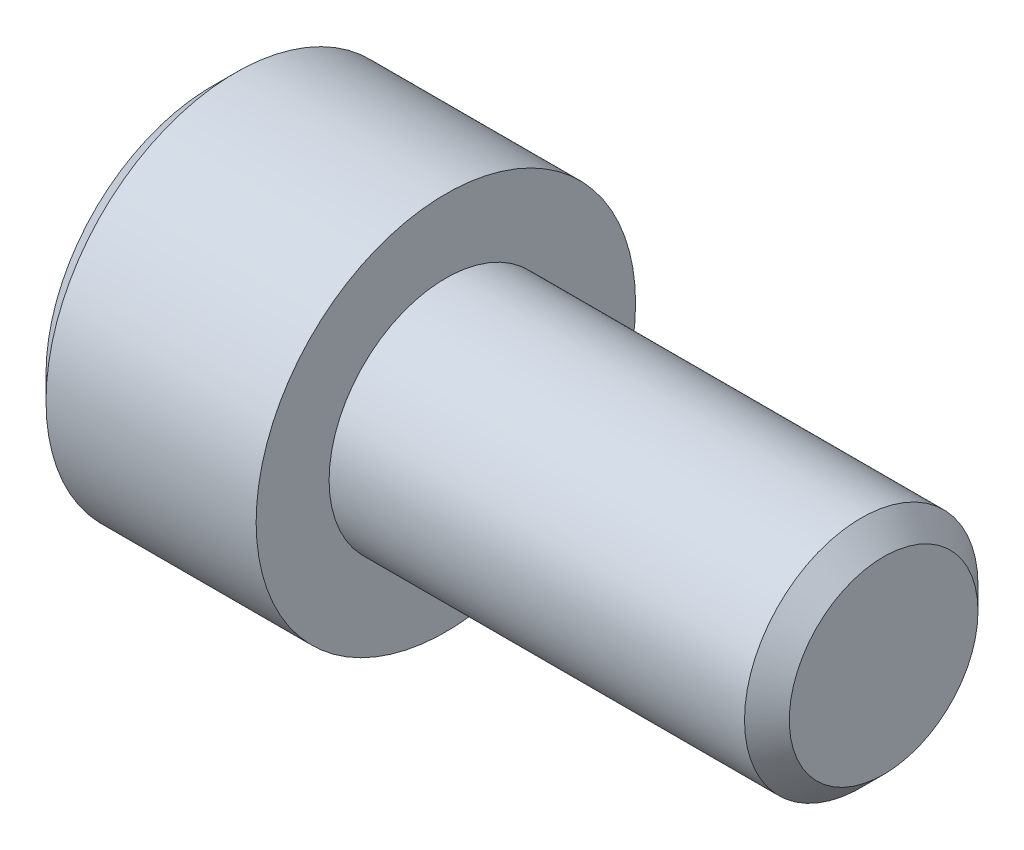
ISO-10303-21;
HEADER;
FILE_DESCRIPTION(('STEP AP214'),'2;1');
FILE_NAME('part.step','',(''),(''),'','','');
FILE_SCHEMA(('AUTOMOTIVE_DESIGN { 1 0 10303 214 1 1 1 1 }'));
ENDSEC;
DATA;
#1=APPLICATION_CONTEXT('core data for automotive mechanical design processes');
#2=APPLICATION_PROTOCOL_DEFINITION('international standard','automotive_design',2000,#1);
#3=PRODUCT_CONTEXT('',#1,'mechanical');
#4=PRODUCT('Part','Part','',(#3));
#5=PRODUCT_RELATED_PRODUCT_CATEGORY('part','',(#4));
#6=PRODUCT_DEFINITION_FORMATION('','',#4);
#7=PRODUCT_DEFINITION_CONTEXT('part definition',#1,'design');
#8=PRODUCT_DEFINITION('design','',#6,#7);
#9=PRODUCT_DEFINITION_SHAPE('','',#8);
#10=(LENGTH_UNIT() NAMED_UNIT(*) SI_UNIT(.MILLI.,.METRE.));
#11=(NAMED_UNIT(*) PLANE_ANGLE_UNIT() SI_UNIT($,.RADIAN.));
#12=(NAMED_UNIT(*) SI_UNIT($,.STERADIAN.) SOLID_ANGLE_UNIT());
#13=UNCERTAINTY_MEASURE_WITH_UNIT(LENGTH_MEASURE(1.E-05),#10,'distance_accuracy_value','');
#14=(GEOMETRIC_REPRESENTATION_CONTEXT(3) GLOBAL_UNCERTAINTY_ASSIGNED_CONTEXT((#13)) GLOBAL_UNIT_ASSIGNED_CONTEXT((#10,
#11,#12)) REPRESENTATION_CONTEXT('',''));
#15=CARTESIAN_POINT('',(0.,0.,0.));
#16=DIRECTION('',(0.,0.,1.));
#17=DIRECTION('',(1.,0.,0.));
#18=AXIS2_PLACEMENT_3D('',#15,#16,#17);
#19=CARTESIAN_POINT('',(-8.,0.,0.));
#20=DIRECTION('',(1.,0.,0.));
#21=DIRECTION('',(0.,0.,-1.));
#22=AXIS2_PLACEMENT_3D('',#19,#20,#21);
#23=PLANE('',#22);
#24=CARTESIAN_POINT('',(-8.,0.,0.));
#25=DIRECTION('',(1.,0.,0.));
#26=DIRECTION('',(0.,0.,-1.));
#27=AXIS2_PLACEMENT_3D('',#24,#25,#26);
#28=CIRCLE('',#27,5.7);
#29=CARTESIAN_POINT('',(-8.,0.,-5.7));
#30=VERTEX_POINT('',#29);
#31=EDGE_CURVE('E115',#30,#30,#28,.T.);
#32=ORIENTED_EDGE('',*,*,#31,.F.);
#33=EDGE_LOOP('',(#32));
#34=FACE_BOUND('',#33,.T.);
#35=DIRECTION('',(0.,0.500000000000001,-0.866025403784438));
#36=VECTOR('',#35,1.);
#37=CARTESIAN_POINT('',(-8.,-3.4641016151378,0.));
#38=LINE('',#37,#36);
#39=CARTESIAN_POINT('',(-8.,-3.4641016151378,0.));
#40=VERTEX_POINT('',#39);
#41=CARTESIAN_POINT('',(-8.,-1.7320508075689,-3.));
#42=VERTEX_POINT('',#41);
#43=EDGE_CURVE('E100',#40,#42,#38,.T.);
#44=ORIENTED_EDGE('',*,*,#43,.T.);
#45=DIRECTION('',(0.,1.,0.));
#46=VECTOR('',#45,1.);
#47=CARTESIAN_POINT('',(-8.,-1.7320508075689,-3.));
#48=LINE('',#47,#46);
#49=CARTESIAN_POINT('',(-8.,1.7320508075689,-3.));
#50=VERTEX_POINT('',#49);
#51=EDGE_CURVE('E88',#42,#50,#48,.T.);
#52=ORIENTED_EDGE('',*,*,#51,.T.);
#53=DIRECTION('',(0.,0.500000000000001,0.866025403784438));
#54=VECTOR('',#53,1.);
#55=CARTESIAN_POINT('',(-8.,1.7320508075689,-3.));
#56=LINE('',#55,#54);
#57=CARTESIAN_POINT('',(-8.,3.4641016151378,0.));
#58=VERTEX_POINT('',#57);
#59=EDGE_CURVE('E99',#50,#58,#56,.T.);
#60=ORIENTED_EDGE('',*,*,#59,.T.);
#61=DIRECTION('',(0.,-0.500000000000001,0.866025403784438));
#62=VECTOR('',#61,1.);
#63=CARTESIAN_POINT('',(-8.,3.4641016151378,0.));
#64=LINE('',#63,#62);
#65=CARTESIAN_POINT('',(-8.,1.7320508075689,3.));
#66=VERTEX_POINT('',#65);
#67=EDGE_CURVE('E125',#58,#66,#64,.T.);
#68=ORIENTED_EDGE('',*,*,#67,.T.);
#69=DIRECTION('',(0.,-1.,0.));
#70=VECTOR('',#69,1.);
#71=CARTESIAN_POINT('',(-8.,1.7320508075689,3.));
#72=LINE('',#71,#70);
#73=CARTESIAN_POINT('',(-8.,-1.7320508075689,3.));
#74=VERTEX_POINT('',#73);
#75=EDGE_CURVE('E130',#66,#74,#72,.T.);
#76=ORIENTED_EDGE('',*,*,#75,.T.);
#77=DIRECTION('',(0.,-0.500000000000001,-0.866025403784438));
#78=VECTOR('',#77,1.);
#79=CARTESIAN_POINT('',(-8.,-1.7320508075689,3.));
#80=LINE('',#79,#78);
#81=EDGE_CURVE('E114',#74,#40,#80,.T.);
#82=ORIENTED_EDGE('',*,*,#81,.T.);
#83=EDGE_LOOP('',(#44,#52,#60,#68,#76,#82));
#84=FACE_BOUND('',#83,.T.);
#85=ADVANCED_FACE('F16',(#34,#84),#23,.F.);
#86=CARTESIAN_POINT('',(-8.,0.,0.));
#87=DIRECTION('',(1.,0.,0.));
#88=DIRECTION('',(0.,0.,-1.));
#89=AXIS2_PLACEMENT_3D('',#86,#87,#88);
#90=CONICAL_SURFACE('',#89,5.7,0.785398163397449);
#91=CARTESIAN_POINT('',(-7.2,0.,0.));
#92=DIRECTION('',(1.,0.,0.));
#93=DIRECTION('',(0.,0.,-1.));
#94=AXIS2_PLACEMENT_3D('',#91,#92,#93);
#95=CIRCLE('',#94,6.5);
#96=CARTESIAN_POINT('',(-7.2,0.,-6.5));
#97=VERTEX_POINT('',#96);
#98=EDGE_CURVE('E137',#97,#97,#95,.T.);
#99=ORIENTED_EDGE('',*,*,#98,.F.);
#100=EDGE_LOOP('',(#99));
#101=FACE_BOUND('',#100,.T.);
#102=ORIENTED_EDGE('',*,*,#31,.T.);
#103=EDGE_LOOP('',(#102));
#104=FACE_BOUND('',#103,.T.);
#105=ADVANCED_FACE('F279',(#101,#104),#90,.T.);
#106=CARTESIAN_POINT('',(-4.,-3.4641016151378,0.));
#107=DIRECTION('',(0.,0.866025403784438,0.500000000000001));
#108=DIRECTION('',(0.,-0.500000000000001,0.866025403784438));
#109=AXIS2_PLACEMENT_3D('',#106,#107,#108);
#110=PLANE('',#109);
#111=ORIENTED_EDGE('',*,*,#43,.F.);
#112=DIRECTION('',(-1.,0.,0.));
#113=VECTOR('',#112,1.);
#114=CARTESIAN_POINT('',(-4.,-3.4641016151378,0.));
#115=LINE('',#114,#113);
#116=CARTESIAN_POINT('',(-4.,-3.4641016151378,0.));
#117=VERTEX_POINT('',#116);
#118=EDGE_CURVE('E142',#117,#40,#115,.T.);
#119=ORIENTED_EDGE('',*,*,#118,.F.);
#120=DIRECTION('',(0.,0.500000000000001,-0.866025403784438));
#121=VECTOR('',#120,1.);
#122=CARTESIAN_POINT('',(-4.,-3.4641016151378,0.));
#123=LINE('',#122,#121);
#124=CARTESIAN_POINT('',(-4.,-2.5980762113533,-1.5));
#125=VERTEX_POINT('',#124);
#126=EDGE_CURVE('E144',#117,#125,#123,.T.);
#127=ORIENTED_EDGE('',*,*,#126,.T.);
#128=DIRECTION('',(0.,0.500000000000001,-0.866025403784438));
#129=VECTOR('',#128,1.);
#130=CARTESIAN_POINT('',(-4.,-2.59807621135334,-1.50000000000002));
#131=LINE('',#130,#129);
#132=CARTESIAN_POINT('',(-4.,-1.7320508075689,-3.));
#133=VERTEX_POINT('',#132);
#134=EDGE_CURVE('E109',#125,#133,#131,.T.);
#135=ORIENTED_EDGE('',*,*,#134,.T.);
#136=DIRECTION('',(-1.,0.,0.));
#137=VECTOR('',#136,1.);
#138=CARTESIAN_POINT('',(-4.,-1.7320508075689,-3.));
#139=LINE('',#138,#137);
#140=EDGE_CURVE('E92',#133,#42,#139,.T.);
#141=ORIENTED_EDGE('',*,*,#140,.T.);
#142=EDGE_LOOP('',(#111,#119,#127,#135,#141));
#143=FACE_BOUND('',#142,.T.);
#144=ADVANCED_FACE('F105',(#143),#110,.T.);
#145=CARTESIAN_POINT('',(-4.,-1.7320508075689,-3.));
#146=DIRECTION('',(0.,0.,1.));
#147=DIRECTION('',(1.,0.,0.));
#148=AXIS2_PLACEMENT_3D('',#145,#146,#147);
#149=PLANE('',#148);
#150=ORIENTED_EDGE('',*,*,#51,.F.);
#151=ORIENTED_EDGE('',*,*,#140,.F.);
#152=DIRECTION('',(0.,1.,0.));
#153=VECTOR('',#152,1.);
#154=CARTESIAN_POINT('',(-4.,-1.7320508075689,-3.));
#155=LINE('',#154,#153);
#156=CARTESIAN_POINT('',(-4.,0.,-3.));
#157=VERTEX_POINT('',#156);
#158=EDGE_CURVE('E110',#133,#157,#155,.T.);
#159=ORIENTED_EDGE('',*,*,#158,.T.);
#160=DIRECTION('',(0.,1.,0.));
#161=VECTOR('',#160,1.);
#162=CARTESIAN_POINT('',(-4.,0.,-3.));
#163=LINE('',#162,#161);
#164=CARTESIAN_POINT('',(-4.,1.7320508075689,-3.));
#165=VERTEX_POINT('',#164);
#166=EDGE_CURVE('E156',#157,#165,#163,.T.);
#167=ORIENTED_EDGE('',*,*,#166,.T.);
#168=DIRECTION('',(-1.,0.,0.));
#169=VECTOR('',#168,1.);
#170=CARTESIAN_POINT('',(-4.,1.7320508075689,-3.));
#171=LINE('',#170,#169);
#172=EDGE_CURVE('E95',#165,#50,#171,.T.);
#173=ORIENTED_EDGE('',*,*,#172,.T.);
#174=EDGE_LOOP('',(#150,#151,#159,#167,#173));
#175=FACE_BOUND('',#174,.T.);
#176=ADVANCED_FACE('F90',(#175),#149,.T.);
#177=CARTESIAN_POINT('',(-4.,1.7320508075689,-3.));
#178=DIRECTION('',(0.,-0.866025403784438,0.500000000000001));
#179=DIRECTION('',(0.,-0.500000000000001,-0.866025403784438));
#180=AXIS2_PLACEMENT_3D('',#177,#178,#179);
#181=PLANE('',#180);
#182=ORIENTED_EDGE('',*,*,#59,.F.);
#183=ORIENTED_EDGE('',*,*,#172,.F.);
#184=DIRECTION('',(0.,0.500000000000001,0.866025403784438));
#185=VECTOR('',#184,1.);
#186=CARTESIAN_POINT('',(-4.,1.7320508075689,-3.));
#187=LINE('',#186,#185);
#188=CARTESIAN_POINT('',(-4.,2.59807621135334,-1.50000000000003));
#189=VERTEX_POINT('',#188);
#190=EDGE_CURVE('E163',#165,#189,#187,.T.);
#191=ORIENTED_EDGE('',*,*,#190,.T.);
#192=DIRECTION('',(0.,0.500000000000001,0.866025403784438));
#193=VECTOR('',#192,1.);
#194=CARTESIAN_POINT('',(-4.,2.59807621135333,-1.50000000000002));
#195=LINE('',#194,#193);
#196=CARTESIAN_POINT('',(-4.,3.4641016151378,0.));
#197=VERTEX_POINT('',#196);
#198=EDGE_CURVE('E168',#189,#197,#195,.T.);
#199=ORIENTED_EDGE('',*,*,#198,.T.);
#200=DIRECTION('',(-1.,0.,0.));
#201=VECTOR('',#200,1.);
#202=CARTESIAN_POINT('',(-4.,3.4641016151378,0.));
#203=LINE('',#202,#201);
#204=EDGE_CURVE('E173',#197,#58,#203,.T.);
#205=ORIENTED_EDGE('',*,*,#204,.T.);
#206=EDGE_LOOP('',(#182,#183,#191,#199,#205));
#207=FACE_BOUND('',#206,.T.);
#208=ADVANCED_FACE('F295',(#207),#181,.T.);
#209=CARTESIAN_POINT('',(-4.,3.4641016151378,0.));
#210=DIRECTION('',(0.,-0.866025403784438,-0.500000000000001));
#211=DIRECTION('',(0.,0.500000000000001,-0.866025403784438));
#212=AXIS2_PLACEMENT_3D('',#209,#210,#211);
#213=PLANE('',#212);
#214=ORIENTED_EDGE('',*,*,#67,.F.);
#215=ORIENTED_EDGE('',*,*,#204,.F.);
#216=DIRECTION('',(0.,-0.500000000000001,0.866025403784438));
#217=VECTOR('',#216,1.);
#218=CARTESIAN_POINT('',(-4.,3.4641016151378,0.));
#219=LINE('',#218,#217);
#220=CARTESIAN_POINT('',(-4.,2.59807621135334,1.50000000000003));
#221=VERTEX_POINT('',#220);
#222=EDGE_CURVE('E178',#197,#221,#219,.T.);
#223=ORIENTED_EDGE('',*,*,#222,.T.);
#224=DIRECTION('',(0.,-0.500000000000001,0.866025403784438));
#225=VECTOR('',#224,1.);
#226=CARTESIAN_POINT('',(-4.,2.59807621135334,1.50000000000003));
#227=LINE('',#226,#225);
#228=CARTESIAN_POINT('',(-4.,1.7320508075689,3.));
#229=VERTEX_POINT('',#228);
#230=EDGE_CURVE('E183',#221,#229,#227,.T.);
#231=ORIENTED_EDGE('',*,*,#230,.T.);
#232=DIRECTION('',(-1.,0.,0.));
#233=VECTOR('',#232,1.);
#234=CARTESIAN_POINT('',(-4.,1.7320508075689,3.));
#235=LINE('',#234,#233);
#236=EDGE_CURVE('E188',#229,#66,#235,.T.);
#237=ORIENTED_EDGE('',*,*,#236,.T.);
#238=EDGE_LOOP('',(#214,#215,#223,#231,#237));
#239=FACE_BOUND('',#238,.T.);
#240=ADVANCED_FACE('F298',(#239),#213,.T.);
#241=CARTESIAN_POINT('',(-4.,1.7320508075689,3.));
#242=DIRECTION('',(0.,0.,-1.));
#243=DIRECTION('',(-1.,0.,0.));
#244=AXIS2_PLACEMENT_3D('',#241,#242,#243);
#245=PLANE('',#244);
#246=ORIENTED_EDGE('',*,*,#75,.F.);
#247=ORIENTED_EDGE('',*,*,#236,.F.);
#248=DIRECTION('',(0.,-1.,0.));
#249=VECTOR('',#248,1.);
#250=CARTESIAN_POINT('',(-4.,1.7320508075689,3.));
#251=LINE('',#250,#249);
#252=CARTESIAN_POINT('',(-4.,0.,3.));
#253=VERTEX_POINT('',#252);
#254=EDGE_CURVE('E193',#229,#253,#251,.T.);
#255=ORIENTED_EDGE('',*,*,#254,.T.);
#256=DIRECTION('',(0.,-1.,0.));
#257=VECTOR('',#256,1.);
#258=CARTESIAN_POINT('',(-4.,0.,3.));
#259=LINE('',#258,#257);
#260=CARTESIAN_POINT('',(-4.,-1.7320508075689,3.));
#261=VERTEX_POINT('',#260);
#262=EDGE_CURVE('E198',#253,#261,#259,.T.);
#263=ORIENTED_EDGE('',*,*,#262,.T.);
#264=DIRECTION('',(-1.,0.,0.));
#265=VECTOR('',#264,1.);
#266=CARTESIAN_POINT('',(-4.,-1.7320508075689,3.));
#267=LINE('',#266,#265);
#268=EDGE_CURVE('E203',#261,#74,#267,.T.);
#269=ORIENTED_EDGE('',*,*,#268,.T.);
#270=EDGE_LOOP('',(#246,#247,#255,#263,#269));
#271=FACE_BOUND('',#270,.T.);
#272=ADVANCED_FACE('F302',(#271),#245,.T.);
#273=CARTESIAN_POINT('',(-4.,-1.7320508075689,3.));
#274=DIRECTION('',(0.,0.866025403784438,-0.500000000000001));
#275=DIRECTION('',(0.,0.500000000000001,0.866025403784438));
#276=AXIS2_PLACEMENT_3D('',#273,#274,#275);
#277=PLANE('',#276);
#278=ORIENTED_EDGE('',*,*,#81,.F.);
#279=ORIENTED_EDGE('',*,*,#268,.F.);
#280=DIRECTION('',(0.,-0.500000000000001,-0.866025403784438));
#281=VECTOR('',#280,1.);
#282=CARTESIAN_POINT('',(-4.,-1.7320508075689,3.));
#283=LINE('',#282,#281);
#284=CARTESIAN_POINT('',(-4.,-2.59807621135334,1.50000000000003));
#285=VERTEX_POINT('',#284);
#286=EDGE_CURVE('E208',#261,#285,#283,.T.);
#287=ORIENTED_EDGE('',*,*,#286,.T.);
#288=DIRECTION('',(0.,-0.500000000000001,-0.866025403784438));
#289=VECTOR('',#288,1.);
#290=CARTESIAN_POINT('',(-4.,-2.59807621135333,1.50000000000002));
#291=LINE('',#290,#289);
#292=EDGE_CURVE('E213',#285,#117,#291,.T.);
#293=ORIENTED_EDGE('',*,*,#292,.T.);
#294=ORIENTED_EDGE('',*,*,#118,.T.);
#295=EDGE_LOOP('',(#278,#279,#287,#293,#294));
#296=FACE_BOUND('',#295,.T.);
#297=ADVANCED_FACE('F275',(#296),#277,.T.);
#298=CARTESIAN_POINT('',(15.,0.,0.));
#299=DIRECTION('',(1.,0.,0.));
#300=DIRECTION('',(0.,0.,-1.));
#301=AXIS2_PLACEMENT_3D('',#298,#299,#300);
#302=CYLINDRICAL_SURFACE('',#301,6.5);
#303=CARTESIAN_POINT('',(0.,0.,0.));
#304=DIRECTION('',(1.,0.,0.));
#305=DIRECTION('',(0.,0.,-1.));
#306=AXIS2_PLACEMENT_3D('',#303,#304,#305);
#307=CIRCLE('',#306,6.5);
#308=CARTESIAN_POINT('',(0.,0.,-6.5));
#309=VERTEX_POINT('',#308);
#310=EDGE_CURVE('E218',#309,#309,#307,.T.);
#311=ORIENTED_EDGE('',*,*,#310,.F.);
#312=EDGE_LOOP('',(#311));
#313=FACE_BOUND('',#312,.T.);
#314=ORIENTED_EDGE('',*,*,#98,.T.);
#315=EDGE_LOOP('',(#314));
#316=FACE_BOUND('',#315,.T.);
#317=ADVANCED_FACE('F271',(#313,#316),#302,.T.);
#318=CARTESIAN_POINT('',(-4.,0.,0.));
#319=DIRECTION('',(1.,0.,0.));
#320=DIRECTION('',(0.,0.,-1.));
#321=AXIS2_PLACEMENT_3D('',#318,#319,#320);
#322=PLANE('',#321);
#323=CARTESIAN_POINT('',(-4.,0.,0.));
#324=DIRECTION('',(1.,0.,0.));
#325=DIRECTION('',(0.,-0.866025403784436,0.500000000000005));
#326=AXIS2_PLACEMENT_3D('',#323,#324,#325);
#327=CIRCLE('',#326,3.);
#328=EDGE_CURVE('E34',#285,#125,#327,.T.);
#329=ORIENTED_EDGE('',*,*,#328,.T.);
#330=ORIENTED_EDGE('',*,*,#126,.F.);
#331=ORIENTED_EDGE('',*,*,#292,.F.);
#332=EDGE_LOOP('',(#329,#330,#331));
#333=FACE_BOUND('',#332,.T.);
#334=ADVANCED_FACE('F274',(#333),#322,.F.);
#335=CARTESIAN_POINT('',(-4.,0.,0.));
#336=DIRECTION('',(1.,0.,0.));
#337=DIRECTION('',(0.,-0.866025403784438,-0.500000000000002));
#338=AXIS2_PLACEMENT_3D('',#335,#336,#337);
#339=CIRCLE('',#338,3.);
#340=EDGE_CURVE('E224',#125,#157,#339,.T.);
#341=ORIENTED_EDGE('',*,*,#340,.T.);
#342=ORIENTED_EDGE('',*,*,#158,.F.);
#343=ORIENTED_EDGE('',*,*,#134,.F.);
#344=EDGE_LOOP('',(#341,#342,#343));
#345=FACE_BOUND('',#344,.T.);
#346=ADVANCED_FACE('F311',(#345),#322,.F.);
#347=CARTESIAN_POINT('',(-4.,0.,0.));
#348=DIRECTION('',(1.,0.,0.));
#349=DIRECTION('',(0.,0.,-1.));
#350=AXIS2_PLACEMENT_3D('',#347,#348,#349);
#351=CIRCLE('',#350,3.);
#352=EDGE_CURVE('E229',#157,#189,#351,.T.);
#353=ORIENTED_EDGE('',*,*,#352,.T.);
#354=ORIENTED_EDGE('',*,*,#190,.F.);
#355=ORIENTED_EDGE('',*,*,#166,.F.);
#356=EDGE_LOOP('',(#353,#354,#355));
#357=FACE_BOUND('',#356,.T.);
#358=ADVANCED_FACE('F379',(#357),#322,.F.);
#359=CARTESIAN_POINT('',(-4.,0.,0.));
#360=DIRECTION('',(1.,0.,0.));
#361=DIRECTION('',(0.,0.866025403784436,-0.500000000000005));
#362=AXIS2_PLACEMENT_3D('',#359,#360,#361);
#363=CIRCLE('',#362,3.);
#364=EDGE_CURVE('E234',#189,#221,#363,.T.);
#365=ORIENTED_EDGE('',*,*,#364,.T.);
#366=ORIENTED_EDGE('',*,*,#222,.F.);
#367=ORIENTED_EDGE('',*,*,#198,.F.);
#368=EDGE_LOOP('',(#365,#366,#367));
#369=FACE_BOUND('',#368,.T.);
#370=ADVANCED_FACE('F370',(#369),#322,.F.);
#371=CARTESIAN_POINT('',(-4.,0.,0.));
#372=DIRECTION('',(1.,0.,0.));
#373=DIRECTION('',(0.,0.866025403784436,0.500000000000005));
#374=AXIS2_PLACEMENT_3D('',#371,#372,#373);
#375=CIRCLE('',#374,3.);
#376=EDGE_CURVE('E239',#221,#253,#375,.T.);
#377=ORIENTED_EDGE('',*,*,#376,.T.);
#378=ORIENTED_EDGE('',*,*,#254,.F.);
#379=ORIENTED_EDGE('',*,*,#230,.F.);
#380=EDGE_LOOP('',(#377,#378,#379));
#381=FACE_BOUND('',#380,.T.);
#382=ADVANCED_FACE('F361',(#381),#322,.F.);
#383=CARTESIAN_POINT('',(-4.,0.,0.));
#384=DIRECTION('',(1.,0.,0.));
#385=DIRECTION('',(0.,0.,1.));
#386=AXIS2_PLACEMENT_3D('',#383,#384,#385);
#387=CIRCLE('',#386,3.);
#388=EDGE_CURVE('E244',#253,#285,#387,.T.);
#389=ORIENTED_EDGE('',*,*,#388,.T.);
#390=ORIENTED_EDGE('',*,*,#286,.F.);
#391=ORIENTED_EDGE('',*,*,#262,.F.);
#392=EDGE_LOOP('',(#389,#390,#391));
#393=FACE_BOUND('',#392,.T.);
#394=ADVANCED_FACE('F267',(#393),#322,.F.);
#395=CARTESIAN_POINT('',(0.,6.5,0.));
#396=DIRECTION('',(-1.,0.,0.));
#397=DIRECTION('',(0.,0.,1.));
#398=AXIS2_PLACEMENT_3D('',#395,#396,#397);
#399=PLANE('',#398);
#400=CARTESIAN_POINT('',(0.,0.,0.));
#401=DIRECTION('',(1.,0.,0.));
#402=DIRECTION('',(0.,0.,-1.));
#403=AXIS2_PLACEMENT_3D('',#400,#401,#402);
#404=CIRCLE('',#403,4.);
#405=CARTESIAN_POINT('',(0.,0.,-4.));
#406=VERTEX_POINT('',#405);
#407=EDGE_CURVE('E248',#406,#406,#404,.T.);
#408=ORIENTED_EDGE('',*,*,#407,.F.);
#409=EDGE_LOOP('',(#408));
#410=FACE_BOUND('',#409,.T.);
#411=ORIENTED_EDGE('',*,*,#310,.T.);
#412=EDGE_LOOP('',(#411));
#413=FACE_BOUND('',#412,.T.);
#414=ADVANCED_FACE('F264',(#410,#413),#399,.F.);
#415=CARTESIAN_POINT('',(-4.,0.,0.));
#416=DIRECTION('',(-1.,0.,0.));
#417=DIRECTION('',(0.,0.,1.));
#418=AXIS2_PLACEMENT_3D('',#415,#416,#417);
#419=CONICAL_SURFACE('',#418,3.,1.30899693899574);
#420=CARTESIAN_POINT('',(-3.1961524227066,0.,0.));
#421=VERTEX_POINT('',#420);
#422=VERTEX_LOOP('',#421);
#423=FACE_BOUND('',#422,.T.);
#424=ORIENTED_EDGE('',*,*,#352,.F.);
#425=ORIENTED_EDGE('',*,*,#340,.F.);
#426=ORIENTED_EDGE('',*,*,#328,.F.);
#427=ORIENTED_EDGE('',*,*,#388,.F.);
#428=ORIENTED_EDGE('',*,*,#376,.F.);
#429=ORIENTED_EDGE('',*,*,#364,.F.);
#430=EDGE_LOOP('',(#424,#425,#426,#427,#428,#429));
#431=FACE_BOUND('',#430,.T.);
#432=ADVANCED_FACE('F260',(#423,#431),#419,.F.);
#433=CARTESIAN_POINT('',(15.,0.,0.));
#434=DIRECTION('',(1.,0.,0.));
#435=DIRECTION('',(0.,0.,-1.));
#436=AXIS2_PLACEMENT_3D('',#433,#434,#435);
#437=CYLINDRICAL_SURFACE('',#436,4.);
#438=CARTESIAN_POINT('',(14.233,0.,0.));
#439=DIRECTION('',(1.,0.,0.));
#440=DIRECTION('',(0.,0.,-1.));
#441=AXIS2_PLACEMENT_3D('',#438,#439,#440);
#442=CIRCLE('',#441,4.);
#443=CARTESIAN_POINT('',(14.233,0.,-4.));
#444=VERTEX_POINT('',#443);
#445=EDGE_CURVE('E24',#444,#444,#442,.T.);
#446=ORIENTED_EDGE('',*,*,#445,.F.);
#447=EDGE_LOOP('',(#446));
#448=FACE_BOUND('',#447,.T.);
#449=ORIENTED_EDGE('',*,*,#407,.T.);
#450=EDGE_LOOP('',(#449));
#451=FACE_BOUND('',#450,.T.);
#452=ADVANCED_FACE('F257',(#448,#451),#437,.T.);
#453=CARTESIAN_POINT('',(14.233,0.,0.));
#454=DIRECTION('',(-1.,0.,0.));
#455=DIRECTION('',(0.,0.,1.));
#456=AXIS2_PLACEMENT_3D('',#453,#454,#455);
#457=CONICAL_SURFACE('',#456,4.,0.785398163397449);
#458=CARTESIAN_POINT('',(15.,0.,0.));
#459=DIRECTION('',(1.,0.,0.));
#460=DIRECTION('',(0.,0.,-1.));
#461=AXIS2_PLACEMENT_3D('',#458,#459,#460);
#462=CIRCLE('',#461,3.233);
#463=CARTESIAN_POINT('',(15.,0.,-3.233));
#464=VERTEX_POINT('',#463);
#465=EDGE_CURVE('E11',#464,#464,#462,.T.);
#466=ORIENTED_EDGE('',*,*,#465,.F.);
#467=EDGE_LOOP('',(#466));
#468=FACE_BOUND('',#467,.T.);
#469=ORIENTED_EDGE('',*,*,#445,.T.);
#470=EDGE_LOOP('',(#469));
#471=FACE_BOUND('',#470,.T.);
#472=ADVANCED_FACE('F255',(#468,#471),#457,.T.);
#473=CARTESIAN_POINT('',(15.,3.233,0.));
#474=DIRECTION('',(-1.,0.,0.));
#475=DIRECTION('',(0.,0.,1.));
#476=AXIS2_PLACEMENT_3D('',#473,#474,#475);
#477=PLANE('',#476);
#478=ORIENTED_EDGE('',*,*,#465,.T.);
#479=EDGE_LOOP('',(#478));
#480=FACE_BOUND('',#479,.T.);
#481=ADVANCED_FACE('F18',(#480),#477,.F.);
#482=CLOSED_SHELL('',(#85,#105,#144,#176,#208,#240,#272,#297,#317,#334,#346,#358,#370,#382,#394,
#414,#432,#452,#472,#481));
#483=MANIFOLD_SOLID_BREP('B1',#482);
#484=ADVANCED_BREP_SHAPE_REPRESENTATION('',(#18,#483),#14);
#485=SHAPE_DEFINITION_REPRESENTATION(#9,#484);
ENDSEC;
END-ISO-10303-21;
